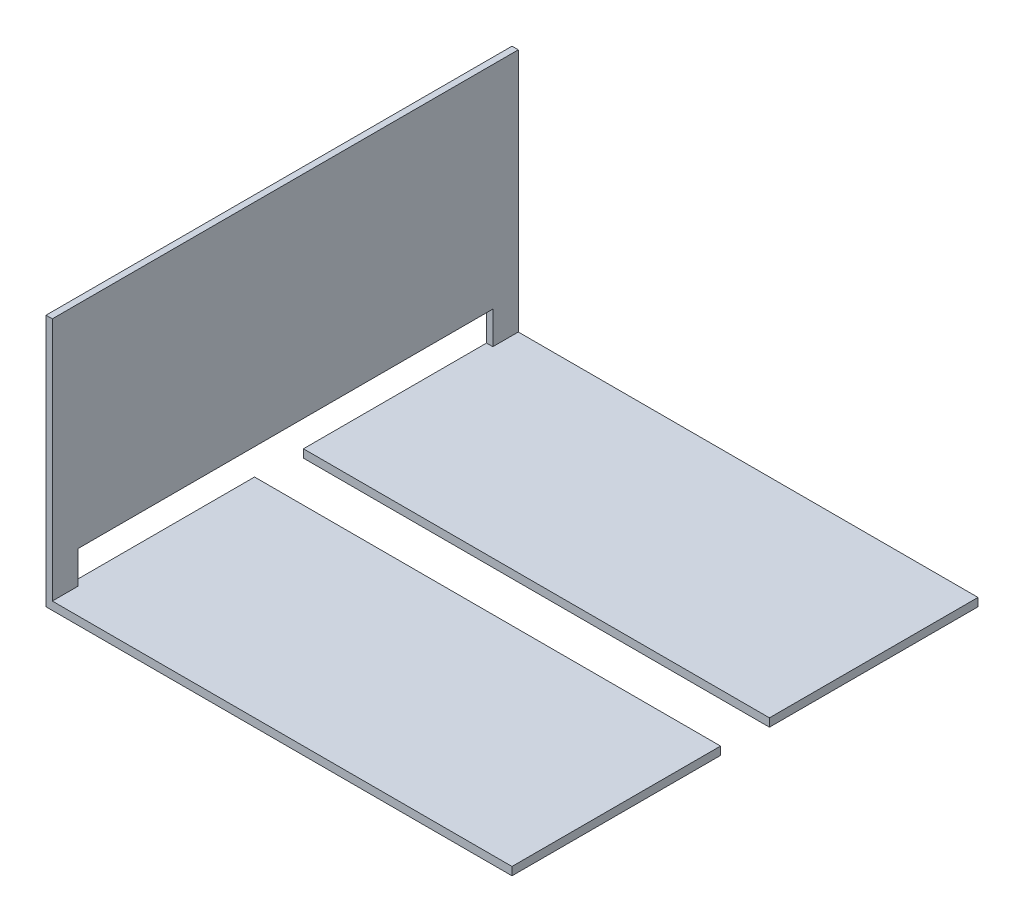
ISO-10303-21;
HEADER;
FILE_DESCRIPTION(('STEP AP214'),'2;1');
FILE_NAME('part.step','',(''),(''),'','','');
FILE_SCHEMA(('AUTOMOTIVE_DESIGN { 1 0 10303 214 1 1 1 1 }'));
ENDSEC;
DATA;
#1=APPLICATION_CONTEXT('core data for automotive mechanical design processes');
#2=APPLICATION_PROTOCOL_DEFINITION('international standard','automotive_design',2000,#1);
#3=PRODUCT_CONTEXT('',#1,'mechanical');
#4=PRODUCT('Part','Part','',(#3));
#5=PRODUCT_RELATED_PRODUCT_CATEGORY('part','',(#4));
#6=PRODUCT_DEFINITION_FORMATION('','',#4);
#7=PRODUCT_DEFINITION_CONTEXT('part definition',#1,'design');
#8=PRODUCT_DEFINITION('design','',#6,#7);
#9=PRODUCT_DEFINITION_SHAPE('','',#8);
#10=(LENGTH_UNIT() NAMED_UNIT(*) SI_UNIT(.MILLI.,.METRE.));
#11=(NAMED_UNIT(*) PLANE_ANGLE_UNIT() SI_UNIT($,.RADIAN.));
#12=(NAMED_UNIT(*) SI_UNIT($,.STERADIAN.) SOLID_ANGLE_UNIT());
#13=UNCERTAINTY_MEASURE_WITH_UNIT(LENGTH_MEASURE(1.E-05),#10,'distance_accuracy_value','');
#14=(GEOMETRIC_REPRESENTATION_CONTEXT(3) GLOBAL_UNCERTAINTY_ASSIGNED_CONTEXT((#13)) GLOBAL_UNIT_ASSIGNED_CONTEXT((#10,
#11,#12)) REPRESENTATION_CONTEXT('',''));
#15=CARTESIAN_POINT('',(0.,0.,0.));
#16=DIRECTION('',(0.,0.,1.));
#17=DIRECTION('',(1.,0.,0.));
#18=AXIS2_PLACEMENT_3D('',#15,#16,#17);
#19=CARTESIAN_POINT('',(0.,5.,0.));
#20=DIRECTION('',(0.,-1.,0.));
#21=DIRECTION('',(0.,0.,-1.));
#22=AXIS2_PLACEMENT_3D('',#19,#20,#21);
#23=PLANE('',#22);
#24=DIRECTION('',(0.,0.,-1.));
#25=VECTOR('',#24,1.);
#26=CARTESIAN_POINT('',(-139.12362056745,5.,143.));
#27=LINE('',#26,#25);
#28=CARTESIAN_POINT('',(-139.12362056745,5.,143.));
#29=VERTEX_POINT('',#28);
#30=CARTESIAN_POINT('',(-139.12362056745,4.99999999999998,127.37036572));
#31=VERTEX_POINT('',#30);
#32=EDGE_CURVE('E50',#29,#31,#27,.T.);
#33=ORIENTED_EDGE('',*,*,#32,.F.);
#34=DIRECTION('',(1.,0.,0.));
#35=VECTOR('',#34,1.);
#36=CARTESIAN_POINT('',(-143.,5.,143.));
#37=LINE('',#36,#35);
#38=CARTESIAN_POINT('',(143.,5.,143.));
#39=VERTEX_POINT('',#38);
#40=EDGE_CURVE('E256',#29,#39,#37,.T.);
#41=ORIENTED_EDGE('',*,*,#40,.T.);
#42=DIRECTION('',(0.,0.,-1.));
#43=VECTOR('',#42,1.);
#44=CARTESIAN_POINT('',(143.,5.,143.));
#45=LINE('',#44,#43);
#46=CARTESIAN_POINT('',(143.,5.,15.));
#47=VERTEX_POINT('',#46);
#48=EDGE_CURVE('E254',#39,#47,#45,.T.);
#49=ORIENTED_EDGE('',*,*,#48,.T.);
#50=DIRECTION('',(1.,0.,0.));
#51=VECTOR('',#50,1.);
#52=CARTESIAN_POINT('',(143.,5.,15.));
#53=LINE('',#52,#51);
#54=CARTESIAN_POINT('',(-143.,5.,15.));
#55=VERTEX_POINT('',#54);
#56=EDGE_CURVE('E150',#55,#47,#53,.T.);
#57=ORIENTED_EDGE('',*,*,#56,.F.);
#58=DIRECTION('',(0.,0.,-1.));
#59=VECTOR('',#58,1.);
#60=CARTESIAN_POINT('',(-143.,5.00000000000002,-127.37036572));
#61=LINE('',#60,#59);
#62=CARTESIAN_POINT('',(-143.,4.99999999999998,127.37036572));
#63=VERTEX_POINT('',#62);
#64=EDGE_CURVE('E148',#63,#55,#61,.T.);
#65=ORIENTED_EDGE('',*,*,#64,.F.);
#66=DIRECTION('',(1.,0.,0.));
#67=VECTOR('',#66,1.);
#68=CARTESIAN_POINT('',(-143.,4.99999999999998,127.37036572));
#69=LINE('',#68,#67);
#70=EDGE_CURVE('E136',#63,#31,#69,.T.);
#71=ORIENTED_EDGE('',*,*,#70,.T.);
#72=EDGE_LOOP('',(#33,#41,#49,#57,#65,#71));
#73=FACE_BOUND('',#72,.T.);
#74=ADVANCED_FACE('F35',(#73),#23,.F.);
#75=CARTESIAN_POINT('',(-132.573463177829,4.,36.981198618569));
#76=DIRECTION('',(0.,-1.,0.));
#77=DIRECTION('',(0.,0.,-1.));
#78=AXIS2_PLACEMENT_3D('',#75,#76,#77);
#79=PLANE('',#78);
#80=CARTESIAN_POINT('',(-132.573463177829,4.,36.981198618569));
#81=DIRECTION('',(0.,-1.,0.));
#82=DIRECTION('',(0.,0.,-1.));
#83=AXIS2_PLACEMENT_3D('',#80,#81,#82);
#84=CIRCLE('',#83,2.49999929794891);
#85=CARTESIAN_POINT('',(-132.573463177829,4.,34.4811993206201));
#86=VERTEX_POINT('',#85);
#87=EDGE_CURVE('E249',#86,#86,#84,.T.);
#88=ORIENTED_EDGE('',*,*,#87,.T.);
#89=EDGE_LOOP('',(#88));
#90=FACE_BOUND('',#89,.T.);
#91=ADVANCED_FACE('F324',(#90),#79,.T.);
#92=CARTESIAN_POINT('',(-132.573463177829,4.,80.981198502569));
#93=DIRECTION('',(0.,-1.,0.));
#94=DIRECTION('',(0.,0.,-1.));
#95=AXIS2_PLACEMENT_3D('',#92,#93,#94);
#96=PLANE('',#95);
#97=CARTESIAN_POINT('',(-132.573463177829,4.,80.981198502569));
#98=DIRECTION('',(0.,-1.,0.));
#99=DIRECTION('',(0.,0.,-1.));
#100=AXIS2_PLACEMENT_3D('',#97,#98,#99);
#101=CIRCLE('',#100,2.49985314110577);
#102=CARTESIAN_POINT('',(-132.573463177829,4.,78.4813453614632));
#103=VERTEX_POINT('',#102);
#104=EDGE_CURVE('E242',#103,#103,#101,.T.);
#105=ORIENTED_EDGE('',*,*,#104,.T.);
#106=EDGE_LOOP('',(#105));
#107=FACE_BOUND('',#106,.T.);
#108=ADVANCED_FACE('F329',(#107),#96,.T.);
#109=CARTESIAN_POINT('',(-132.573463177829,4.,36.981198618569));
#110=DIRECTION('',(0.,-1.,0.));
#111=DIRECTION('',(0.,0.,-1.));
#112=AXIS2_PLACEMENT_3D('',#109,#110,#111);
#113=CYLINDRICAL_SURFACE('',#112,2.49999929794891);
#114=ORIENTED_EDGE('',*,*,#87,.F.);
#115=EDGE_LOOP('',(#114));
#116=FACE_BOUND('',#115,.T.);
#117=CARTESIAN_POINT('',(-132.573463177829,0.,36.981198618569));
#118=DIRECTION('',(0.,-1.,0.));
#119=DIRECTION('',(0.,0.,-1.));
#120=AXIS2_PLACEMENT_3D('',#117,#118,#119);
#121=CIRCLE('',#120,2.49999929794891);
#122=CARTESIAN_POINT('',(-132.573463177829,0.,34.4811993206201));
#123=VERTEX_POINT('',#122);
#124=EDGE_CURVE('E240',#123,#123,#121,.T.);
#125=ORIENTED_EDGE('',*,*,#124,.T.);
#126=EDGE_LOOP('',(#125));
#127=FACE_BOUND('',#126,.T.);
#128=ADVANCED_FACE('F334',(#116,#127),#113,.F.);
#129=CARTESIAN_POINT('',(-132.573463177829,4.,80.981198502569));
#130=DIRECTION('',(0.,-1.,0.));
#131=DIRECTION('',(0.,0.,-1.));
#132=AXIS2_PLACEMENT_3D('',#129,#130,#131);
#133=CYLINDRICAL_SURFACE('',#132,2.49985314110577);
#134=ORIENTED_EDGE('',*,*,#104,.F.);
#135=EDGE_LOOP('',(#134));
#136=FACE_BOUND('',#135,.T.);
#137=CARTESIAN_POINT('',(-132.573463177829,0.,80.981198502569));
#138=DIRECTION('',(0.,-1.,0.));
#139=DIRECTION('',(0.,0.,-1.));
#140=AXIS2_PLACEMENT_3D('',#137,#138,#139);
#141=CIRCLE('',#140,2.49985314110577);
#142=CARTESIAN_POINT('',(-132.573463177829,0.,78.4813453614632));
#143=VERTEX_POINT('',#142);
#144=EDGE_CURVE('E246',#143,#143,#141,.T.);
#145=ORIENTED_EDGE('',*,*,#144,.T.);
#146=EDGE_LOOP('',(#145));
#147=FACE_BOUND('',#146,.T.);
#148=ADVANCED_FACE('F338',(#136,#147),#133,.F.);
#149=CARTESIAN_POINT('',(-143.,5.,143.));
#150=DIRECTION('',(0.,0.,-1.));
#151=DIRECTION('',(-1.,0.,0.));
#152=AXIS2_PLACEMENT_3D('',#149,#150,#151);
#153=PLANE('',#152);
#154=DIRECTION('',(1.,0.,0.));
#155=VECTOR('',#154,1.);
#156=CARTESIAN_POINT('',(-143.,0.,143.));
#157=LINE('',#156,#155);
#158=CARTESIAN_POINT('',(-143.,0.,143.));
#159=VERTEX_POINT('',#158);
#160=CARTESIAN_POINT('',(143.,0.,143.));
#161=VERTEX_POINT('',#160);
#162=EDGE_CURVE('E257',#159,#161,#157,.T.);
#163=ORIENTED_EDGE('',*,*,#162,.T.);
#164=DIRECTION('',(0.,-1.,0.));
#165=VECTOR('',#164,1.);
#166=CARTESIAN_POINT('',(143.,5.,143.));
#167=LINE('',#166,#165);
#168=EDGE_CURVE('E43',#39,#161,#167,.T.);
#169=ORIENTED_EDGE('',*,*,#168,.F.);
#170=ORIENTED_EDGE('',*,*,#40,.F.);
#171=DIRECTION('',(0.,-1.,0.));
#172=VECTOR('',#171,1.);
#173=CARTESIAN_POINT('',(-139.12362056745,155.,143.));
#174=LINE('',#173,#172);
#175=CARTESIAN_POINT('',(-139.12362056745,155.,143.));
#176=VERTEX_POINT('',#175);
#177=EDGE_CURVE('E232',#176,#29,#174,.T.);
#178=ORIENTED_EDGE('',*,*,#177,.F.);
#179=DIRECTION('',(1.,0.,0.));
#180=VECTOR('',#179,1.);
#181=CARTESIAN_POINT('',(-143.,155.,143.));
#182=LINE('',#181,#180);
#183=CARTESIAN_POINT('',(-143.,155.,143.));
#184=VERTEX_POINT('',#183);
#185=EDGE_CURVE('E220',#184,#176,#182,.T.);
#186=ORIENTED_EDGE('',*,*,#185,.F.);
#187=DIRECTION('',(0.,-1.,0.));
#188=VECTOR('',#187,1.);
#189=CARTESIAN_POINT('',(-143.,5.,143.));
#190=LINE('',#189,#188);
#191=EDGE_CURVE('E11',#184,#159,#190,.T.);
#192=ORIENTED_EDGE('',*,*,#191,.T.);
#193=EDGE_LOOP('',(#163,#169,#170,#178,#186,#192));
#194=FACE_BOUND('',#193,.T.);
#195=ADVANCED_FACE('F277',(#194),#153,.F.);
#196=CARTESIAN_POINT('',(0.,0.,0.));
#197=DIRECTION('',(0.,-1.,0.));
#198=DIRECTION('',(0.,0.,-1.));
#199=AXIS2_PLACEMENT_3D('',#196,#197,#198);
#200=PLANE('',#199);
#201=DIRECTION('',(1.,0.,0.));
#202=VECTOR('',#201,1.);
#203=CARTESIAN_POINT('',(143.,0.,15.));
#204=LINE('',#203,#202);
#205=CARTESIAN_POINT('',(-143.,0.,15.));
#206=VERTEX_POINT('',#205);
#207=CARTESIAN_POINT('',(143.,0.,15.));
#208=VERTEX_POINT('',#207);
#209=EDGE_CURVE('E235',#206,#208,#204,.T.);
#210=ORIENTED_EDGE('',*,*,#209,.T.);
#211=DIRECTION('',(0.,0.,-1.));
#212=VECTOR('',#211,1.);
#213=CARTESIAN_POINT('',(143.,0.,143.));
#214=LINE('',#213,#212);
#215=EDGE_CURVE('E245',#161,#208,#214,.T.);
#216=ORIENTED_EDGE('',*,*,#215,.F.);
#217=ORIENTED_EDGE('',*,*,#162,.F.);
#218=DIRECTION('',(0.,0.,1.));
#219=VECTOR('',#218,1.);
#220=CARTESIAN_POINT('',(-143.,0.,143.));
#221=LINE('',#220,#219);
#222=EDGE_CURVE('E261',#206,#159,#221,.T.);
#223=ORIENTED_EDGE('',*,*,#222,.F.);
#224=EDGE_LOOP('',(#210,#216,#217,#223));
#225=FACE_BOUND('',#224,.T.);
#226=ORIENTED_EDGE('',*,*,#144,.F.);
#227=EDGE_LOOP('',(#226));
#228=FACE_BOUND('',#227,.T.);
#229=ORIENTED_EDGE('',*,*,#124,.F.);
#230=EDGE_LOOP('',(#229));
#231=FACE_BOUND('',#230,.T.);
#232=ADVANCED_FACE('F271',(#225,#228,#231),#200,.T.);
#233=CARTESIAN_POINT('',(-143.,5.,143.));
#234=DIRECTION('',(1.,0.,0.));
#235=DIRECTION('',(0.,0.,-1.));
#236=AXIS2_PLACEMENT_3D('',#233,#234,#235);
#237=PLANE('',#236);
#238=DIRECTION('',(0.,-1.,0.));
#239=VECTOR('',#238,1.);
#240=CARTESIAN_POINT('',(-143.,25.,127.37036572));
#241=LINE('',#240,#239);
#242=CARTESIAN_POINT('',(-143.,25.,127.37036572));
#243=VERTEX_POINT('',#242);
#244=EDGE_CURVE('E140',#243,#63,#241,.T.);
#245=ORIENTED_EDGE('',*,*,#244,.T.);
#246=ORIENTED_EDGE('',*,*,#64,.T.);
#247=DIRECTION('',(0.,1.,0.));
#248=VECTOR('',#247,1.);
#249=CARTESIAN_POINT('',(-143.,0.,15.));
#250=LINE('',#249,#248);
#251=EDGE_CURVE('E237',#206,#55,#250,.T.);
#252=ORIENTED_EDGE('',*,*,#251,.F.);
#253=ORIENTED_EDGE('',*,*,#222,.T.);
#254=ORIENTED_EDGE('',*,*,#191,.F.);
#255=DIRECTION('',(0.,0.,1.));
#256=VECTOR('',#255,1.);
#257=CARTESIAN_POINT('',(-143.,155.,143.));
#258=LINE('',#257,#256);
#259=CARTESIAN_POINT('',(-143.,155.,-143.));
#260=VERTEX_POINT('',#259);
#261=EDGE_CURVE('E217',#260,#184,#258,.T.);
#262=ORIENTED_EDGE('',*,*,#261,.F.);
#263=DIRECTION('',(0.,-1.,0.));
#264=VECTOR('',#263,1.);
#265=CARTESIAN_POINT('',(-143.,155.,-143.));
#266=LINE('',#265,#264);
#267=CARTESIAN_POINT('',(-143.,0.,-143.));
#268=VERTEX_POINT('',#267);
#269=EDGE_CURVE('E226',#260,#268,#266,.T.);
#270=ORIENTED_EDGE('',*,*,#269,.T.);
#271=DIRECTION('',(0.,0.,1.));
#272=VECTOR('',#271,1.);
#273=CARTESIAN_POINT('',(-143.,0.,143.));
#274=LINE('',#273,#272);
#275=CARTESIAN_POINT('',(-143.,0.,-15.));
#276=VERTEX_POINT('',#275);
#277=EDGE_CURVE('E207',#268,#276,#274,.T.);
#278=ORIENTED_EDGE('',*,*,#277,.T.);
#279=DIRECTION('',(0.,1.,0.));
#280=VECTOR('',#279,1.);
#281=CARTESIAN_POINT('',(-143.,0.,-15.));
#282=LINE('',#281,#280);
#283=CARTESIAN_POINT('',(-143.,5.,-15.));
#284=VERTEX_POINT('',#283);
#285=EDGE_CURVE('E204',#276,#284,#282,.T.);
#286=ORIENTED_EDGE('',*,*,#285,.T.);
#287=CARTESIAN_POINT('',(-143.,5.00000000000002,-127.37036572));
#288=VERTEX_POINT('',#287);
#289=EDGE_CURVE('E155',#284,#288,#61,.T.);
#290=ORIENTED_EDGE('',*,*,#289,.T.);
#291=DIRECTION('',(0.,1.,0.));
#292=VECTOR('',#291,1.);
#293=CARTESIAN_POINT('',(-143.,25.,-127.37036572));
#294=LINE('',#293,#292);
#295=CARTESIAN_POINT('',(-143.,25.,-127.37036572));
#296=VERTEX_POINT('',#295);
#297=EDGE_CURVE('E154',#288,#296,#294,.T.);
#298=ORIENTED_EDGE('',*,*,#297,.T.);
#299=DIRECTION('',(0.,0.,1.));
#300=VECTOR('',#299,1.);
#301=CARTESIAN_POINT('',(-143.,25.,-127.37036572));
#302=LINE('',#301,#300);
#303=EDGE_CURVE('E145',#296,#243,#302,.T.);
#304=ORIENTED_EDGE('',*,*,#303,.T.);
#305=EDGE_LOOP('',(#245,#246,#252,#253,#254,#262,#270,#278,#286,#290,#298,#304));
#306=FACE_BOUND('',#305,.T.);
#307=ADVANCED_FACE('F157',(#306),#237,.F.);
#308=CARTESIAN_POINT('',(143.,5.,143.));
#309=DIRECTION('',(-1.,0.,0.));
#310=DIRECTION('',(0.,0.,1.));
#311=AXIS2_PLACEMENT_3D('',#308,#309,#310);
#312=PLANE('',#311);
#313=ORIENTED_EDGE('',*,*,#215,.T.);
#314=DIRECTION('',(0.,1.,0.));
#315=VECTOR('',#314,1.);
#316=CARTESIAN_POINT('',(143.,0.,15.));
#317=LINE('',#316,#315);
#318=EDGE_CURVE('E58',#208,#47,#317,.T.);
#319=ORIENTED_EDGE('',*,*,#318,.T.);
#320=ORIENTED_EDGE('',*,*,#48,.F.);
#321=ORIENTED_EDGE('',*,*,#168,.T.);
#322=EDGE_LOOP('',(#313,#319,#320,#321));
#323=FACE_BOUND('',#322,.T.);
#324=ADVANCED_FACE('F37',(#323),#312,.F.);
#325=CARTESIAN_POINT('',(143.,0.,15.));
#326=DIRECTION('',(0.,0.,1.));
#327=DIRECTION('',(1.,0.,0.));
#328=AXIS2_PLACEMENT_3D('',#325,#326,#327);
#329=PLANE('',#328);
#330=ORIENTED_EDGE('',*,*,#56,.T.);
#331=ORIENTED_EDGE('',*,*,#318,.F.);
#332=ORIENTED_EDGE('',*,*,#209,.F.);
#333=ORIENTED_EDGE('',*,*,#251,.T.);
#334=EDGE_LOOP('',(#330,#331,#332,#333));
#335=FACE_BOUND('',#334,.T.);
#336=ADVANCED_FACE('F274',(#335),#329,.F.);
#337=CARTESIAN_POINT('',(-139.12362056745,155.,143.));
#338=DIRECTION('',(-1.,0.,0.));
#339=DIRECTION('',(0.,0.,1.));
#340=AXIS2_PLACEMENT_3D('',#337,#338,#339);
#341=PLANE('',#340);
#342=ORIENTED_EDGE('',*,*,#32,.T.);
#343=DIRECTION('',(0.,-1.,0.));
#344=VECTOR('',#343,1.);
#345=CARTESIAN_POINT('',(-139.12362056745,25.,127.37036572));
#346=LINE('',#345,#344);
#347=CARTESIAN_POINT('',(-139.12362056745,25.,127.37036572));
#348=VERTEX_POINT('',#347);
#349=EDGE_CURVE('E143',#348,#31,#346,.T.);
#350=ORIENTED_EDGE('',*,*,#349,.F.);
#351=DIRECTION('',(0.,0.,1.));
#352=VECTOR('',#351,1.);
#353=CARTESIAN_POINT('',(-139.12362056745,25.,-127.37036572));
#354=LINE('',#353,#352);
#355=CARTESIAN_POINT('',(-139.12362056745,25.,-127.37036572));
#356=VERTEX_POINT('',#355);
#357=EDGE_CURVE('E160',#356,#348,#354,.T.);
#358=ORIENTED_EDGE('',*,*,#357,.F.);
#359=DIRECTION('',(0.,1.,0.));
#360=VECTOR('',#359,1.);
#361=CARTESIAN_POINT('',(-139.12362056745,25.,-127.37036572));
#362=LINE('',#361,#360);
#363=CARTESIAN_POINT('',(-139.12362056745,5.00000000000002,-127.37036572));
#364=VERTEX_POINT('',#363);
#365=EDGE_CURVE('E164',#364,#356,#362,.T.);
#366=ORIENTED_EDGE('',*,*,#365,.F.);
#367=DIRECTION('',(0.,0.,1.));
#368=VECTOR('',#367,1.);
#369=CARTESIAN_POINT('',(-139.12362056745,5.,143.));
#370=LINE('',#369,#368);
#371=CARTESIAN_POINT('',(-139.12362056745,5.,-143.));
#372=VERTEX_POINT('',#371);
#373=EDGE_CURVE('E203',#372,#364,#370,.T.);
#374=ORIENTED_EDGE('',*,*,#373,.F.);
#375=DIRECTION('',(0.,-1.,0.));
#376=VECTOR('',#375,1.);
#377=CARTESIAN_POINT('',(-139.12362056745,155.,-143.));
#378=LINE('',#377,#376);
#379=CARTESIAN_POINT('',(-139.12362056745,155.,-143.));
#380=VERTEX_POINT('',#379);
#381=EDGE_CURVE('E229',#380,#372,#378,.T.);
#382=ORIENTED_EDGE('',*,*,#381,.F.);
#383=DIRECTION('',(0.,0.,-1.));
#384=VECTOR('',#383,1.);
#385=CARTESIAN_POINT('',(-139.12362056745,155.,143.));
#386=LINE('',#385,#384);
#387=EDGE_CURVE('E222',#176,#380,#386,.T.);
#388=ORIENTED_EDGE('',*,*,#387,.F.);
#389=ORIENTED_EDGE('',*,*,#177,.T.);
#390=EDGE_LOOP('',(#342,#350,#358,#366,#374,#382,#388,#389));
#391=FACE_BOUND('',#390,.T.);
#392=ADVANCED_FACE('F307',(#391),#341,.F.);
#393=CARTESIAN_POINT('',(-143.,155.,-143.));
#394=DIRECTION('',(0.,0.,1.));
#395=DIRECTION('',(1.,0.,0.));
#396=AXIS2_PLACEMENT_3D('',#393,#394,#395);
#397=PLANE('',#396);
#398=ORIENTED_EDGE('',*,*,#381,.T.);
#399=DIRECTION('',(-1.,0.,0.));
#400=VECTOR('',#399,1.);
#401=CARTESIAN_POINT('',(-143.,5.,-143.));
#402=LINE('',#401,#400);
#403=CARTESIAN_POINT('',(143.,5.,-143.));
#404=VERTEX_POINT('',#403);
#405=EDGE_CURVE('E186',#404,#372,#402,.T.);
#406=ORIENTED_EDGE('',*,*,#405,.F.);
#407=DIRECTION('',(0.,-1.,0.));
#408=VECTOR('',#407,1.);
#409=CARTESIAN_POINT('',(143.,5.,-143.));
#410=LINE('',#409,#408);
#411=CARTESIAN_POINT('',(143.,0.,-143.));
#412=VERTEX_POINT('',#411);
#413=EDGE_CURVE('E178',#404,#412,#410,.T.);
#414=ORIENTED_EDGE('',*,*,#413,.T.);
#415=DIRECTION('',(-1.,0.,0.));
#416=VECTOR('',#415,1.);
#417=CARTESIAN_POINT('',(-143.,0.,-143.));
#418=LINE('',#417,#416);
#419=EDGE_CURVE('E182',#412,#268,#418,.T.);
#420=ORIENTED_EDGE('',*,*,#419,.T.);
#421=ORIENTED_EDGE('',*,*,#269,.F.);
#422=DIRECTION('',(-1.,0.,0.));
#423=VECTOR('',#422,1.);
#424=CARTESIAN_POINT('',(-143.,155.,-143.));
#425=LINE('',#424,#423);
#426=EDGE_CURVE('E224',#380,#260,#425,.T.);
#427=ORIENTED_EDGE('',*,*,#426,.F.);
#428=EDGE_LOOP('',(#398,#406,#414,#420,#421,#427));
#429=FACE_BOUND('',#428,.T.);
#430=ADVANCED_FACE('F287',(#429),#397,.F.);
#431=CARTESIAN_POINT('',(0.,155.,0.));
#432=DIRECTION('',(0.,-1.,0.));
#433=DIRECTION('',(0.,0.,-1.));
#434=AXIS2_PLACEMENT_3D('',#431,#432,#433);
#435=PLANE('',#434);
#436=ORIENTED_EDGE('',*,*,#261,.T.);
#437=ORIENTED_EDGE('',*,*,#185,.T.);
#438=ORIENTED_EDGE('',*,*,#387,.T.);
#439=ORIENTED_EDGE('',*,*,#426,.T.);
#440=EDGE_LOOP('',(#436,#437,#438,#439));
#441=FACE_BOUND('',#440,.T.);
#442=ADVANCED_FACE('F281',(#441),#435,.F.);
#443=CARTESIAN_POINT('',(0.,5.,0.));
#444=DIRECTION('',(0.,-1.,0.));
#445=DIRECTION('',(0.,0.,-1.));
#446=AXIS2_PLACEMENT_3D('',#443,#444,#445);
#447=PLANE('',#446);
#448=ORIENTED_EDGE('',*,*,#405,.T.);
#449=ORIENTED_EDGE('',*,*,#373,.T.);
#450=DIRECTION('',(1.,0.,0.));
#451=VECTOR('',#450,1.);
#452=CARTESIAN_POINT('',(-143.,5.00000000000002,-127.37036572));
#453=LINE('',#452,#451);
#454=EDGE_CURVE('E144',#288,#364,#453,.T.);
#455=ORIENTED_EDGE('',*,*,#454,.F.);
#456=ORIENTED_EDGE('',*,*,#289,.F.);
#457=DIRECTION('',(-1.,0.,0.));
#458=VECTOR('',#457,1.);
#459=CARTESIAN_POINT('',(143.,5.,-15.));
#460=LINE('',#459,#458);
#461=CARTESIAN_POINT('',(143.,5.,-15.));
#462=VERTEX_POINT('',#461);
#463=EDGE_CURVE('E200',#462,#284,#460,.T.);
#464=ORIENTED_EDGE('',*,*,#463,.F.);
#465=DIRECTION('',(0.,0.,-1.));
#466=VECTOR('',#465,1.);
#467=CARTESIAN_POINT('',(143.,5.,143.));
#468=LINE('',#467,#466);
#469=EDGE_CURVE('E188',#462,#404,#468,.T.);
#470=ORIENTED_EDGE('',*,*,#469,.T.);
#471=EDGE_LOOP('',(#448,#449,#455,#456,#464,#470));
#472=FACE_BOUND('',#471,.T.);
#473=ADVANCED_FACE('F302',(#472),#447,.F.);
#474=CARTESIAN_POINT('',(143.,5.,143.));
#475=DIRECTION('',(-1.,0.,0.));
#476=DIRECTION('',(0.,0.,1.));
#477=AXIS2_PLACEMENT_3D('',#474,#475,#476);
#478=PLANE('',#477);
#479=ORIENTED_EDGE('',*,*,#469,.F.);
#480=DIRECTION('',(0.,1.,0.));
#481=VECTOR('',#480,1.);
#482=CARTESIAN_POINT('',(143.,0.,-15.));
#483=LINE('',#482,#481);
#484=CARTESIAN_POINT('',(143.,0.,-15.));
#485=VERTEX_POINT('',#484);
#486=EDGE_CURVE('E201',#485,#462,#483,.T.);
#487=ORIENTED_EDGE('',*,*,#486,.F.);
#488=DIRECTION('',(0.,0.,-1.));
#489=VECTOR('',#488,1.);
#490=CARTESIAN_POINT('',(143.,0.,143.));
#491=LINE('',#490,#489);
#492=EDGE_CURVE('E174',#485,#412,#491,.T.);
#493=ORIENTED_EDGE('',*,*,#492,.T.);
#494=ORIENTED_EDGE('',*,*,#413,.F.);
#495=EDGE_LOOP('',(#479,#487,#493,#494));
#496=FACE_BOUND('',#495,.T.);
#497=ADVANCED_FACE('F300',(#496),#478,.F.);
#498=CARTESIAN_POINT('',(0.,0.,0.));
#499=DIRECTION('',(0.,-1.,0.));
#500=DIRECTION('',(0.,0.,-1.));
#501=AXIS2_PLACEMENT_3D('',#498,#499,#500);
#502=PLANE('',#501);
#503=DIRECTION('',(-1.,0.,0.));
#504=VECTOR('',#503,1.);
#505=CARTESIAN_POINT('',(143.,0.,-15.));
#506=LINE('',#505,#504);
#507=EDGE_CURVE('E185',#485,#276,#506,.T.);
#508=ORIENTED_EDGE('',*,*,#507,.T.);
#509=ORIENTED_EDGE('',*,*,#277,.F.);
#510=ORIENTED_EDGE('',*,*,#419,.F.);
#511=ORIENTED_EDGE('',*,*,#492,.F.);
#512=EDGE_LOOP('',(#508,#509,#510,#511));
#513=FACE_BOUND('',#512,.T.);
#514=CARTESIAN_POINT('',(-132.569572232283,0.,-80.9811986025604));
#515=DIRECTION('',(0.,-1.,0.));
#516=DIRECTION('',(0.,0.,-1.));
#517=AXIS2_PLACEMENT_3D('',#514,#515,#516);
#518=CIRCLE('',#517,2.49989679732586);
#519=CARTESIAN_POINT('',(-132.569572232283,0.,-83.4810953998862));
#520=VERTEX_POINT('',#519);
#521=EDGE_CURVE('E181',#520,#520,#518,.T.);
#522=ORIENTED_EDGE('',*,*,#521,.F.);
#523=EDGE_LOOP('',(#522));
#524=FACE_BOUND('',#523,.T.);
#525=CARTESIAN_POINT('',(-132.569572232283,0.,-36.9811987185604));
#526=DIRECTION('',(0.,-1.,0.));
#527=DIRECTION('',(0.,0.,-1.));
#528=AXIS2_PLACEMENT_3D('',#525,#526,#527);
#529=CIRCLE('',#528,2.49989679732586);
#530=CARTESIAN_POINT('',(-132.569572232283,0.,-39.4810955158862));
#531=VERTEX_POINT('',#530);
#532=EDGE_CURVE('E194',#531,#531,#529,.T.);
#533=ORIENTED_EDGE('',*,*,#532,.F.);
#534=EDGE_LOOP('',(#533));
#535=FACE_BOUND('',#534,.T.);
#536=ADVANCED_FACE('F292',(#513,#524,#535),#502,.T.);
#537=CARTESIAN_POINT('',(-132.569572232283,4.,-80.9811986025604));
#538=DIRECTION('',(0.,-1.,0.));
#539=DIRECTION('',(0.,0.,-1.));
#540=AXIS2_PLACEMENT_3D('',#537,#538,#539);
#541=CYLINDRICAL_SURFACE('',#540,2.49989679732586);
#542=CARTESIAN_POINT('',(-132.569572232283,4.,-80.9811986025604));
#543=DIRECTION('',(0.,-1.,0.));
#544=DIRECTION('',(0.,0.,-1.));
#545=AXIS2_PLACEMENT_3D('',#542,#543,#544);
#546=CIRCLE('',#545,2.49989679732586);
#547=CARTESIAN_POINT('',(-132.569572232283,4.,-83.4810953998862));
#548=VERTEX_POINT('',#547);
#549=EDGE_CURVE('E191',#548,#548,#546,.T.);
#550=ORIENTED_EDGE('',*,*,#549,.F.);
#551=EDGE_LOOP('',(#550));
#552=FACE_BOUND('',#551,.T.);
#553=ORIENTED_EDGE('',*,*,#521,.T.);
#554=EDGE_LOOP('',(#553));
#555=FACE_BOUND('',#554,.T.);
#556=ADVANCED_FACE('F426',(#552,#555),#541,.F.);
#557=CARTESIAN_POINT('',(-132.569572232283,4.,-80.9811986025604));
#558=DIRECTION('',(0.,-1.,0.));
#559=DIRECTION('',(0.,0.,-1.));
#560=AXIS2_PLACEMENT_3D('',#557,#558,#559);
#561=PLANE('',#560);
#562=ORIENTED_EDGE('',*,*,#549,.T.);
#563=EDGE_LOOP('',(#562));
#564=FACE_BOUND('',#563,.T.);
#565=ADVANCED_FACE('F434',(#564),#561,.T.);
#566=CARTESIAN_POINT('',(-132.569572232283,4.,-36.9811987185604));
#567=DIRECTION('',(0.,-1.,0.));
#568=DIRECTION('',(0.,0.,-1.));
#569=AXIS2_PLACEMENT_3D('',#566,#567,#568);
#570=CYLINDRICAL_SURFACE('',#569,2.49989679732586);
#571=CARTESIAN_POINT('',(-132.569572232283,4.,-36.9811987185604));
#572=DIRECTION('',(0.,-1.,0.));
#573=DIRECTION('',(0.,0.,-1.));
#574=AXIS2_PLACEMENT_3D('',#571,#572,#573);
#575=CIRCLE('',#574,2.49989679732586);
#576=CARTESIAN_POINT('',(-132.569572232283,4.,-39.4810955158862));
#577=VERTEX_POINT('',#576);
#578=EDGE_CURVE('E197',#577,#577,#575,.T.);
#579=ORIENTED_EDGE('',*,*,#578,.F.);
#580=EDGE_LOOP('',(#579));
#581=FACE_BOUND('',#580,.T.);
#582=ORIENTED_EDGE('',*,*,#532,.T.);
#583=EDGE_LOOP('',(#582));
#584=FACE_BOUND('',#583,.T.);
#585=ADVANCED_FACE('F443',(#581,#584),#570,.F.);
#586=CARTESIAN_POINT('',(-132.569572232283,4.,-36.9811987185604));
#587=DIRECTION('',(0.,-1.,0.));
#588=DIRECTION('',(0.,0.,-1.));
#589=AXIS2_PLACEMENT_3D('',#586,#587,#588);
#590=PLANE('',#589);
#591=ORIENTED_EDGE('',*,*,#578,.T.);
#592=EDGE_LOOP('',(#591));
#593=FACE_BOUND('',#592,.T.);
#594=ADVANCED_FACE('F452',(#593),#590,.T.);
#595=CARTESIAN_POINT('',(143.,0.,-15.));
#596=DIRECTION('',(0.,0.,-1.));
#597=DIRECTION('',(-1.,0.,0.));
#598=AXIS2_PLACEMENT_3D('',#595,#596,#597);
#599=PLANE('',#598);
#600=ORIENTED_EDGE('',*,*,#463,.T.);
#601=ORIENTED_EDGE('',*,*,#285,.F.);
#602=ORIENTED_EDGE('',*,*,#507,.F.);
#603=ORIENTED_EDGE('',*,*,#486,.T.);
#604=EDGE_LOOP('',(#600,#601,#602,#603));
#605=FACE_BOUND('',#604,.T.);
#606=ADVANCED_FACE('F296',(#605),#599,.F.);
#607=CARTESIAN_POINT('',(-143.,25.,127.37036572));
#608=DIRECTION('',(0.,0.,1.));
#609=DIRECTION('',(1.,0.,0.));
#610=AXIS2_PLACEMENT_3D('',#607,#608,#609);
#611=PLANE('',#610);
#612=ORIENTED_EDGE('',*,*,#349,.T.);
#613=ORIENTED_EDGE('',*,*,#70,.F.);
#614=ORIENTED_EDGE('',*,*,#244,.F.);
#615=DIRECTION('',(1.,0.,0.));
#616=VECTOR('',#615,1.);
#617=CARTESIAN_POINT('',(-143.,25.,127.37036572));
#618=LINE('',#617,#616);
#619=EDGE_CURVE('E172',#243,#348,#618,.T.);
#620=ORIENTED_EDGE('',*,*,#619,.T.);
#621=EDGE_LOOP('',(#612,#613,#614,#620));
#622=FACE_BOUND('',#621,.T.);
#623=ADVANCED_FACE('F138',(#622),#611,.F.);
#624=CARTESIAN_POINT('',(-143.,25.,-127.37036572));
#625=DIRECTION('',(0.,1.,0.));
#626=DIRECTION('',(0.,0.,1.));
#627=AXIS2_PLACEMENT_3D('',#624,#625,#626);
#628=PLANE('',#627);
#629=ORIENTED_EDGE('',*,*,#357,.T.);
#630=ORIENTED_EDGE('',*,*,#619,.F.);
#631=ORIENTED_EDGE('',*,*,#303,.F.);
#632=DIRECTION('',(1.,0.,0.));
#633=VECTOR('',#632,1.);
#634=CARTESIAN_POINT('',(-143.,25.,-127.37036572));
#635=LINE('',#634,#633);
#636=EDGE_CURVE('E175',#296,#356,#635,.T.);
#637=ORIENTED_EDGE('',*,*,#636,.T.);
#638=EDGE_LOOP('',(#629,#630,#631,#637));
#639=FACE_BOUND('',#638,.T.);
#640=ADVANCED_FACE('F314',(#639),#628,.F.);
#641=CARTESIAN_POINT('',(-143.,25.,-127.37036572));
#642=DIRECTION('',(0.,0.,-1.));
#643=DIRECTION('',(-1.,0.,0.));
#644=AXIS2_PLACEMENT_3D('',#641,#642,#643);
#645=PLANE('',#644);
#646=ORIENTED_EDGE('',*,*,#365,.T.);
#647=ORIENTED_EDGE('',*,*,#636,.F.);
#648=ORIENTED_EDGE('',*,*,#297,.F.);
#649=ORIENTED_EDGE('',*,*,#454,.T.);
#650=EDGE_LOOP('',(#646,#647,#648,#649));
#651=FACE_BOUND('',#650,.T.);
#652=ADVANCED_FACE('F312',(#651),#645,.F.);
#653=CLOSED_SHELL('',(#74,#91,#108,#128,#148,#195,#232,#307,#324,#336,#392,#430,#442,#473,#497,
#536,#556,#565,#585,#594,#606,#623,#640,#652));
#654=MANIFOLD_SOLID_BREP('B2',#653);
#655=ADVANCED_BREP_SHAPE_REPRESENTATION('',(#18,#654),#14);
#656=SHAPE_DEFINITION_REPRESENTATION(#9,#655);
ENDSEC;
END-ISO-10303-21;
